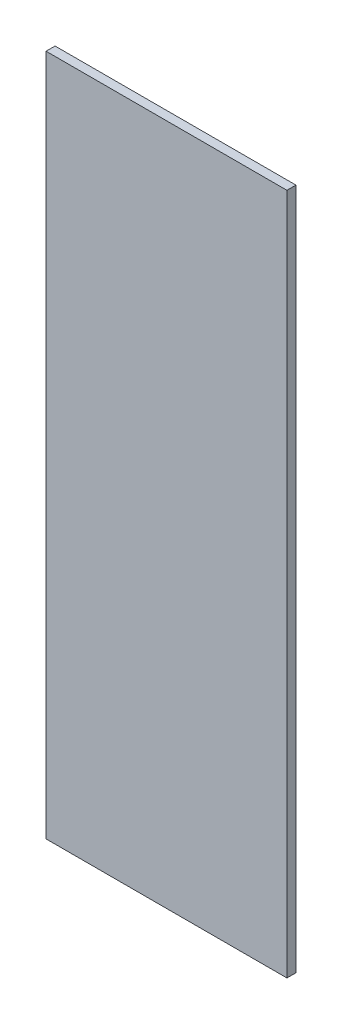
ISO-10303-21;
HEADER;
FILE_DESCRIPTION(('STEP AP214'),'2;1');
FILE_NAME('part.step','',(''),(''),'','','');
FILE_SCHEMA(('AUTOMOTIVE_DESIGN { 1 0 10303 214 1 1 1 1 }'));
ENDSEC;
DATA;
#1=APPLICATION_CONTEXT('core data for automotive mechanical design processes');
#2=APPLICATION_PROTOCOL_DEFINITION('international standard','automotive_design',2000,#1);
#3=PRODUCT_CONTEXT('',#1,'mechanical');
#4=PRODUCT('Part','Part','',(#3));
#5=PRODUCT_RELATED_PRODUCT_CATEGORY('part','',(#4));
#6=PRODUCT_DEFINITION_FORMATION('','',#4);
#7=PRODUCT_DEFINITION_CONTEXT('part definition',#1,'design');
#8=PRODUCT_DEFINITION('design','',#6,#7);
#9=PRODUCT_DEFINITION_SHAPE('','',#8);
#10=(LENGTH_UNIT() NAMED_UNIT(*) SI_UNIT(.MILLI.,.METRE.));
#11=(NAMED_UNIT(*) PLANE_ANGLE_UNIT() SI_UNIT($,.RADIAN.));
#12=(NAMED_UNIT(*) SI_UNIT($,.STERADIAN.) SOLID_ANGLE_UNIT());
#13=UNCERTAINTY_MEASURE_WITH_UNIT(LENGTH_MEASURE(1.E-05),#10,'distance_accuracy_value','');
#14=(GEOMETRIC_REPRESENTATION_CONTEXT(3) GLOBAL_UNCERTAINTY_ASSIGNED_CONTEXT((#13)) GLOBAL_UNIT_ASSIGNED_CONTEXT((#10,
#11,#12)) REPRESENTATION_CONTEXT('',''));
#15=CARTESIAN_POINT('',(0.,0.,0.));
#16=DIRECTION('',(0.,0.,1.));
#17=DIRECTION('',(1.,0.,0.));
#18=AXIS2_PLACEMENT_3D('',#15,#16,#17);
#19=CARTESIAN_POINT('',(53.5,-151.5,4.));
#20=DIRECTION('',(-1.,0.,0.));
#21=DIRECTION('',(0.,0.,1.));
#22=AXIS2_PLACEMENT_3D('',#19,#20,#21);
#23=PLANE('',#22);
#24=DIRECTION('',(0.,1.,0.));
#25=VECTOR('',#24,1.);
#26=CARTESIAN_POINT('',(53.5,-151.5,0.));
#27=LINE('',#26,#25);
#28=CARTESIAN_POINT('',(53.5,-151.5,0.));
#29=VERTEX_POINT('',#28);
#30=CARTESIAN_POINT('',(53.5,151.5,0.));
#31=VERTEX_POINT('',#30);
#32=EDGE_CURVE('E110',#29,#31,#27,.T.);
#33=ORIENTED_EDGE('',*,*,#32,.T.);
#34=DIRECTION('',(0.,0.,-1.));
#35=VECTOR('',#34,1.);
#36=CARTESIAN_POINT('',(53.5,151.5,4.));
#37=LINE('',#36,#35);
#38=CARTESIAN_POINT('',(53.5,151.5,4.));
#39=VERTEX_POINT('',#38);
#40=EDGE_CURVE('E11',#39,#31,#37,.T.);
#41=ORIENTED_EDGE('',*,*,#40,.F.);
#42=DIRECTION('',(0.,1.,0.));
#43=VECTOR('',#42,1.);
#44=CARTESIAN_POINT('',(53.5,-151.5,4.));
#45=LINE('',#44,#43);
#46=CARTESIAN_POINT('',(53.5,-151.5,4.));
#47=VERTEX_POINT('',#46);
#48=EDGE_CURVE('E93',#47,#39,#45,.T.);
#49=ORIENTED_EDGE('',*,*,#48,.F.);
#50=DIRECTION('',(0.,0.,-1.));
#51=VECTOR('',#50,1.);
#52=CARTESIAN_POINT('',(53.5,-151.5,4.));
#53=LINE('',#52,#51);
#54=EDGE_CURVE('E106',#47,#29,#53,.T.);
#55=ORIENTED_EDGE('',*,*,#54,.T.);
#56=EDGE_LOOP('',(#33,#41,#49,#55));
#57=FACE_BOUND('',#56,.T.);
#58=ADVANCED_FACE('F41',(#57),#23,.F.);
#59=CARTESIAN_POINT('',(-53.5,151.5,4.));
#60=DIRECTION('',(0.,-1.,0.));
#61=DIRECTION('',(0.,0.,-1.));
#62=AXIS2_PLACEMENT_3D('',#59,#60,#61);
#63=PLANE('',#62);
#64=DIRECTION('',(-1.,0.,0.));
#65=VECTOR('',#64,1.);
#66=CARTESIAN_POINT('',(-53.5,151.5,0.));
#67=LINE('',#66,#65);
#68=CARTESIAN_POINT('',(-53.5,151.5,0.));
#69=VERTEX_POINT('',#68);
#70=EDGE_CURVE('E98',#31,#69,#67,.T.);
#71=ORIENTED_EDGE('',*,*,#70,.T.);
#72=DIRECTION('',(0.,0.,-1.));
#73=VECTOR('',#72,1.);
#74=CARTESIAN_POINT('',(-53.5,151.5,4.));
#75=LINE('',#74,#73);
#76=CARTESIAN_POINT('',(-53.5,151.5,4.));
#77=VERTEX_POINT('',#76);
#78=EDGE_CURVE('E50',#77,#69,#75,.T.);
#79=ORIENTED_EDGE('',*,*,#78,.F.);
#80=DIRECTION('',(-1.,0.,0.));
#81=VECTOR('',#80,1.);
#82=CARTESIAN_POINT('',(-53.5,151.5,4.));
#83=LINE('',#82,#81);
#84=EDGE_CURVE('E88',#39,#77,#83,.T.);
#85=ORIENTED_EDGE('',*,*,#84,.F.);
#86=ORIENTED_EDGE('',*,*,#40,.T.);
#87=EDGE_LOOP('',(#71,#79,#85,#86));
#88=FACE_BOUND('',#87,.T.);
#89=ADVANCED_FACE('F97',(#88),#63,.F.);
#90=CARTESIAN_POINT('',(-53.5,-151.5,4.));
#91=DIRECTION('',(1.,0.,0.));
#92=DIRECTION('',(0.,0.,-1.));
#93=AXIS2_PLACEMENT_3D('',#90,#91,#92);
#94=PLANE('',#93);
#95=DIRECTION('',(0.,-1.,0.));
#96=VECTOR('',#95,1.);
#97=CARTESIAN_POINT('',(-53.5,-151.5,0.));
#98=LINE('',#97,#96);
#99=CARTESIAN_POINT('',(-53.5,-151.5,0.));
#100=VERTEX_POINT('',#99);
#101=EDGE_CURVE('E75',#69,#100,#98,.T.);
#102=ORIENTED_EDGE('',*,*,#101,.T.);
#103=DIRECTION('',(0.,0.,-1.));
#104=VECTOR('',#103,1.);
#105=CARTESIAN_POINT('',(-53.5,-151.5,4.));
#106=LINE('',#105,#104);
#107=CARTESIAN_POINT('',(-53.5,-151.5,4.));
#108=VERTEX_POINT('',#107);
#109=EDGE_CURVE('E100',#108,#100,#106,.T.);
#110=ORIENTED_EDGE('',*,*,#109,.F.);
#111=DIRECTION('',(0.,-1.,0.));
#112=VECTOR('',#111,1.);
#113=CARTESIAN_POINT('',(-53.5,-151.5,4.));
#114=LINE('',#113,#112);
#115=EDGE_CURVE('E91',#77,#108,#114,.T.);
#116=ORIENTED_EDGE('',*,*,#115,.F.);
#117=ORIENTED_EDGE('',*,*,#78,.T.);
#118=EDGE_LOOP('',(#102,#110,#116,#117));
#119=FACE_BOUND('',#118,.T.);
#120=ADVANCED_FACE('F101',(#119),#94,.F.);
#121=CARTESIAN_POINT('',(-53.5,-151.5,4.));
#122=DIRECTION('',(0.,1.,0.));
#123=DIRECTION('',(0.,0.,1.));
#124=AXIS2_PLACEMENT_3D('',#121,#122,#123);
#125=PLANE('',#124);
#126=DIRECTION('',(1.,0.,0.));
#127=VECTOR('',#126,1.);
#128=CARTESIAN_POINT('',(-53.5,-151.5,0.));
#129=LINE('',#128,#127);
#130=EDGE_CURVE('E81',#100,#29,#129,.T.);
#131=ORIENTED_EDGE('',*,*,#130,.T.);
#132=ORIENTED_EDGE('',*,*,#54,.F.);
#133=DIRECTION('',(1.,0.,0.));
#134=VECTOR('',#133,1.);
#135=CARTESIAN_POINT('',(-53.5,-151.5,4.));
#136=LINE('',#135,#134);
#137=EDGE_CURVE('E58',#108,#47,#136,.T.);
#138=ORIENTED_EDGE('',*,*,#137,.F.);
#139=ORIENTED_EDGE('',*,*,#109,.T.);
#140=EDGE_LOOP('',(#131,#132,#138,#139));
#141=FACE_BOUND('',#140,.T.);
#142=ADVANCED_FACE('F124',(#141),#125,.F.);
#143=CARTESIAN_POINT('',(0.,0.,4.));
#144=DIRECTION('',(0.,0.,-1.));
#145=DIRECTION('',(-1.,0.,0.));
#146=AXIS2_PLACEMENT_3D('',#143,#144,#145);
#147=PLANE('',#146);
#148=ORIENTED_EDGE('',*,*,#48,.T.);
#149=ORIENTED_EDGE('',*,*,#84,.T.);
#150=ORIENTED_EDGE('',*,*,#115,.T.);
#151=ORIENTED_EDGE('',*,*,#137,.T.);
#152=EDGE_LOOP('',(#148,#149,#150,#151));
#153=FACE_BOUND('',#152,.T.);
#154=ADVANCED_FACE('F89',(#153),#147,.F.);
#155=CARTESIAN_POINT('',(0.,0.,0.));
#156=DIRECTION('',(0.,0.,-1.));
#157=DIRECTION('',(-1.,0.,0.));
#158=AXIS2_PLACEMENT_3D('',#155,#156,#157);
#159=PLANE('',#158);
#160=ORIENTED_EDGE('',*,*,#32,.F.);
#161=ORIENTED_EDGE('',*,*,#130,.F.);
#162=ORIENTED_EDGE('',*,*,#101,.F.);
#163=ORIENTED_EDGE('',*,*,#70,.F.);
#164=EDGE_LOOP('',(#160,#161,#162,#163));
#165=FACE_BOUND('',#164,.T.);
#166=ADVANCED_FACE('F127',(#165),#159,.T.);
#167=CLOSED_SHELL('',(#58,#89,#120,#142,#154,#166));
#168=MANIFOLD_SOLID_BREP('B2',#167);
#169=ADVANCED_BREP_SHAPE_REPRESENTATION('',(#18,#168),#14);
#170=SHAPE_DEFINITION_REPRESENTATION(#9,#169);
ENDSEC;
END-ISO-10303-21;
